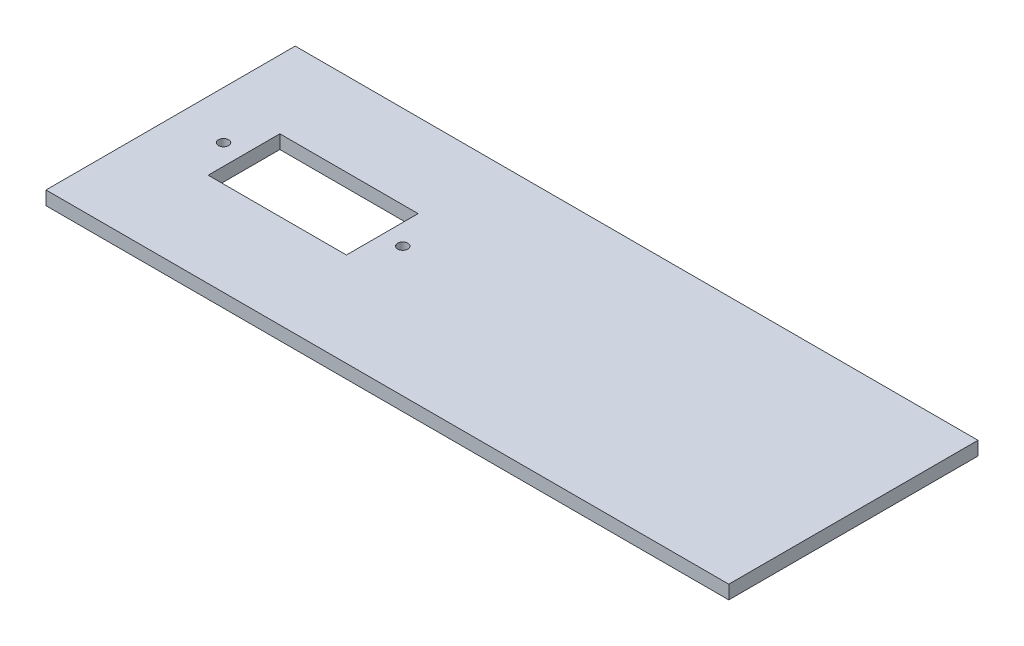
ISO-10303-21;
HEADER;
FILE_DESCRIPTION(('STEP AP214'),'2;1');
FILE_NAME('part.step','',(''),(''),'','','');
FILE_SCHEMA(('AUTOMOTIVE_DESIGN { 1 0 10303 214 1 1 1 1 }'));
ENDSEC;
DATA;
#1=APPLICATION_CONTEXT('core data for automotive mechanical design processes');
#2=APPLICATION_PROTOCOL_DEFINITION('international standard','automotive_design',2000,#1);
#3=PRODUCT_CONTEXT('',#1,'mechanical');
#4=PRODUCT('Part','Part','',(#3));
#5=PRODUCT_RELATED_PRODUCT_CATEGORY('part','',(#4));
#6=PRODUCT_DEFINITION_FORMATION('','',#4);
#7=PRODUCT_DEFINITION_CONTEXT('part definition',#1,'design');
#8=PRODUCT_DEFINITION('design','',#6,#7);
#9=PRODUCT_DEFINITION_SHAPE('','',#8);
#10=(LENGTH_UNIT() NAMED_UNIT(*) SI_UNIT(.MILLI.,.METRE.));
#11=(NAMED_UNIT(*) PLANE_ANGLE_UNIT() SI_UNIT($,.RADIAN.));
#12=(NAMED_UNIT(*) SI_UNIT($,.STERADIAN.) SOLID_ANGLE_UNIT());
#13=UNCERTAINTY_MEASURE_WITH_UNIT(LENGTH_MEASURE(1.E-05),#10,'distance_accuracy_value','');
#14=(GEOMETRIC_REPRESENTATION_CONTEXT(3) GLOBAL_UNCERTAINTY_ASSIGNED_CONTEXT((#13)) GLOBAL_UNIT_ASSIGNED_CONTEXT((#10,
#11,#12)) REPRESENTATION_CONTEXT('',''));
#15=CARTESIAN_POINT('',(0.,0.,0.));
#16=DIRECTION('',(0.,0.,1.));
#17=DIRECTION('',(1.,0.,0.));
#18=AXIS2_PLACEMENT_3D('',#15,#16,#17);
#19=CARTESIAN_POINT('',(-200.,-2.,36.5));
#20=DIRECTION('',(0.,0.,1.));
#21=DIRECTION('',(1.,0.,0.));
#22=AXIS2_PLACEMENT_3D('',#19,#20,#21);
#23=PLANE('',#22);
#24=DIRECTION('',(0.,-1.,0.));
#25=VECTOR('',#24,1.);
#26=CARTESIAN_POINT('',(0.,-2.,36.5));
#27=LINE('',#26,#25);
#28=CARTESIAN_POINT('',(0.,1.99999999999999,36.5));
#29=VERTEX_POINT('',#28);
#30=CARTESIAN_POINT('',(0.,-2.,36.5));
#31=VERTEX_POINT('',#30);
#32=EDGE_CURVE('E123',#29,#31,#27,.T.);
#33=ORIENTED_EDGE('',*,*,#32,.F.);
#34=DIRECTION('',(1.,0.,0.));
#35=VECTOR('',#34,1.);
#36=CARTESIAN_POINT('',(-200.,1.99999999999999,36.5));
#37=LINE('',#36,#35);
#38=CARTESIAN_POINT('',(-200.,1.99999999999999,36.5));
#39=VERTEX_POINT('',#38);
#40=EDGE_CURVE('E150',#39,#29,#37,.T.);
#41=ORIENTED_EDGE('',*,*,#40,.F.);
#42=DIRECTION('',(0.,-1.,0.));
#43=VECTOR('',#42,1.);
#44=CARTESIAN_POINT('',(-200.,-2.,36.5));
#45=LINE('',#44,#43);
#46=CARTESIAN_POINT('',(-200.,-2.,36.5));
#47=VERTEX_POINT('',#46);
#48=EDGE_CURVE('E126',#39,#47,#45,.T.);
#49=ORIENTED_EDGE('',*,*,#48,.T.);
#50=DIRECTION('',(1.,0.,0.));
#51=VECTOR('',#50,1.);
#52=CARTESIAN_POINT('',(-200.,-2.,36.5));
#53=LINE('',#52,#51);
#54=EDGE_CURVE('E139',#47,#31,#53,.T.);
#55=ORIENTED_EDGE('',*,*,#54,.T.);
#56=EDGE_LOOP('',(#33,#41,#49,#55));
#57=FACE_BOUND('',#56,.T.);
#58=ADVANCED_FACE('F32',(#57),#23,.T.);
#59=CARTESIAN_POINT('',(-200.,2.,-36.5));
#60=DIRECTION('',(0.,1.,0.));
#61=DIRECTION('',(0.,0.,1.));
#62=AXIS2_PLACEMENT_3D('',#59,#60,#61);
#63=PLANE('',#62);
#64=CARTESIAN_POINT('',(-133.5,2.,-1.50000000000001));
#65=DIRECTION('',(0.,1.,0.));
#66=DIRECTION('',(0.,0.,-1.));
#67=AXIS2_PLACEMENT_3D('',#64,#65,#66);
#68=CIRCLE('',#67,1.5);
#69=CARTESIAN_POINT('',(-133.5,2.,-3.00000000000001));
#70=VERTEX_POINT('',#69);
#71=EDGE_CURVE('E170',#70,#70,#68,.T.);
#72=ORIENTED_EDGE('',*,*,#71,.F.);
#73=EDGE_LOOP('',(#72));
#74=FACE_BOUND('',#73,.T.);
#75=CARTESIAN_POINT('',(-186.,2.,-1.50000000000001));
#76=DIRECTION('',(0.,1.,0.));
#77=DIRECTION('',(0.,0.,1.));
#78=AXIS2_PLACEMENT_3D('',#75,#76,#77);
#79=CIRCLE('',#78,1.5);
#80=CARTESIAN_POINT('',(-186.,2.,0.));
#81=VERTEX_POINT('',#80);
#82=EDGE_CURVE('E162',#81,#81,#79,.T.);
#83=ORIENTED_EDGE('',*,*,#82,.F.);
#84=EDGE_LOOP('',(#83));
#85=FACE_BOUND('',#84,.T.);
#86=DIRECTION('',(0.,0.,-1.));
#87=VECTOR('',#86,1.);
#88=CARTESIAN_POINT('',(-139.5,2.,-12.));
#89=LINE('',#88,#87);
#90=CARTESIAN_POINT('',(-139.5,2.,8.99999999999999));
#91=VERTEX_POINT('',#90);
#92=CARTESIAN_POINT('',(-139.5,2.,-12.));
#93=VERTEX_POINT('',#92);
#94=EDGE_CURVE('E48',#91,#93,#89,.T.);
#95=ORIENTED_EDGE('',*,*,#94,.F.);
#96=DIRECTION('',(1.,0.,0.));
#97=VECTOR('',#96,1.);
#98=CARTESIAN_POINT('',(-180.,2.,8.99999999999999));
#99=LINE('',#98,#97);
#100=CARTESIAN_POINT('',(-180.,2.,8.99999999999999));
#101=VERTEX_POINT('',#100);
#102=EDGE_CURVE('E116',#101,#91,#99,.T.);
#103=ORIENTED_EDGE('',*,*,#102,.F.);
#104=DIRECTION('',(0.,0.,1.));
#105=VECTOR('',#104,1.);
#106=CARTESIAN_POINT('',(-180.,2.,-12.));
#107=LINE('',#106,#105);
#108=CARTESIAN_POINT('',(-180.,2.,-12.));
#109=VERTEX_POINT('',#108);
#110=EDGE_CURVE('E100',#109,#101,#107,.T.);
#111=ORIENTED_EDGE('',*,*,#110,.F.);
#112=DIRECTION('',(-1.,0.,0.));
#113=VECTOR('',#112,1.);
#114=CARTESIAN_POINT('',(-180.,2.,-12.));
#115=LINE('',#114,#113);
#116=EDGE_CURVE('E109',#93,#109,#115,.T.);
#117=ORIENTED_EDGE('',*,*,#116,.F.);
#118=EDGE_LOOP('',(#95,#103,#111,#117));
#119=FACE_BOUND('',#118,.T.);
#120=DIRECTION('',(0.,0.,1.));
#121=VECTOR('',#120,1.);
#122=CARTESIAN_POINT('',(0.,2.,-36.5));
#123=LINE('',#122,#121);
#124=CARTESIAN_POINT('',(0.,2.,-36.5));
#125=VERTEX_POINT('',#124);
#126=EDGE_CURVE('E130',#125,#29,#123,.T.);
#127=ORIENTED_EDGE('',*,*,#126,.F.);
#128=DIRECTION('',(1.,0.,0.));
#129=VECTOR('',#128,1.);
#130=CARTESIAN_POINT('',(-200.,2.,-36.5));
#131=LINE('',#130,#129);
#132=CARTESIAN_POINT('',(-200.,2.,-36.5));
#133=VERTEX_POINT('',#132);
#134=EDGE_CURVE('E153',#133,#125,#131,.T.);
#135=ORIENTED_EDGE('',*,*,#134,.F.);
#136=DIRECTION('',(0.,0.,1.));
#137=VECTOR('',#136,1.);
#138=CARTESIAN_POINT('',(-200.,2.,-36.5));
#139=LINE('',#138,#137);
#140=EDGE_CURVE('E136',#133,#39,#139,.T.);
#141=ORIENTED_EDGE('',*,*,#140,.T.);
#142=ORIENTED_EDGE('',*,*,#40,.T.);
#143=EDGE_LOOP('',(#127,#135,#141,#142));
#144=FACE_BOUND('',#143,.T.);
#145=ADVANCED_FACE('F113',(#74,#85,#119,#144),#63,.T.);
#146=CARTESIAN_POINT('',(-200.,-2.,-36.5));
#147=DIRECTION('',(0.,0.,-1.));
#148=DIRECTION('',(-1.,0.,0.));
#149=AXIS2_PLACEMENT_3D('',#146,#147,#148);
#150=PLANE('',#149);
#151=DIRECTION('',(0.,1.,0.));
#152=VECTOR('',#151,1.);
#153=CARTESIAN_POINT('',(0.,-2.,-36.5));
#154=LINE('',#153,#152);
#155=CARTESIAN_POINT('',(0.,-2.,-36.5));
#156=VERTEX_POINT('',#155);
#157=EDGE_CURVE('E145',#156,#125,#154,.T.);
#158=ORIENTED_EDGE('',*,*,#157,.F.);
#159=DIRECTION('',(1.,0.,0.));
#160=VECTOR('',#159,1.);
#161=CARTESIAN_POINT('',(-200.,-2.,-36.5));
#162=LINE('',#161,#160);
#163=CARTESIAN_POINT('',(-200.,-2.,-36.5));
#164=VERTEX_POINT('',#163);
#165=EDGE_CURVE('E155',#164,#156,#162,.T.);
#166=ORIENTED_EDGE('',*,*,#165,.F.);
#167=DIRECTION('',(0.,1.,0.));
#168=VECTOR('',#167,1.);
#169=CARTESIAN_POINT('',(-200.,-2.,-36.5));
#170=LINE('',#169,#168);
#171=EDGE_CURVE('E133',#164,#133,#170,.T.);
#172=ORIENTED_EDGE('',*,*,#171,.T.);
#173=ORIENTED_EDGE('',*,*,#134,.T.);
#174=EDGE_LOOP('',(#158,#166,#172,#173));
#175=FACE_BOUND('',#174,.T.);
#176=ADVANCED_FACE('F179',(#175),#150,.T.);
#177=CARTESIAN_POINT('',(-200.,-2.,-36.5));
#178=DIRECTION('',(0.,-1.,0.));
#179=DIRECTION('',(0.,0.,-1.));
#180=AXIS2_PLACEMENT_3D('',#177,#178,#179);
#181=PLANE('',#180);
#182=CARTESIAN_POINT('',(-133.5,-2.,-1.50000000000002));
#183=DIRECTION('',(0.,-1.,0.));
#184=DIRECTION('',(0.,0.,-1.));
#185=AXIS2_PLACEMENT_3D('',#182,#183,#184);
#186=CIRCLE('',#185,1.5);
#187=CARTESIAN_POINT('',(-133.5,-2.,-3.00000000000001));
#188=VERTEX_POINT('',#187);
#189=EDGE_CURVE('E35',#188,#188,#186,.T.);
#190=ORIENTED_EDGE('',*,*,#189,.F.);
#191=EDGE_LOOP('',(#190));
#192=FACE_BOUND('',#191,.T.);
#193=CARTESIAN_POINT('',(-186.,-2.,-1.50000000000001));
#194=DIRECTION('',(0.,-1.,0.));
#195=DIRECTION('',(0.,0.,-1.));
#196=AXIS2_PLACEMENT_3D('',#193,#194,#195);
#197=CIRCLE('',#196,1.5);
#198=CARTESIAN_POINT('',(-186.,-2.,-3.00000000000001));
#199=VERTEX_POINT('',#198);
#200=EDGE_CURVE('E160',#199,#199,#197,.T.);
#201=ORIENTED_EDGE('',*,*,#200,.F.);
#202=EDGE_LOOP('',(#201));
#203=FACE_BOUND('',#202,.T.);
#204=DIRECTION('',(0.,0.,1.));
#205=VECTOR('',#204,1.);
#206=CARTESIAN_POINT('',(-139.5,-2.,-36.5));
#207=LINE('',#206,#205);
#208=CARTESIAN_POINT('',(-139.5,-2.,-12.));
#209=VERTEX_POINT('',#208);
#210=CARTESIAN_POINT('',(-139.5,-2.,8.99999999999999));
#211=VERTEX_POINT('',#210);
#212=EDGE_CURVE('E11',#209,#211,#207,.T.);
#213=ORIENTED_EDGE('',*,*,#212,.F.);
#214=DIRECTION('',(1.,0.,0.));
#215=VECTOR('',#214,1.);
#216=CARTESIAN_POINT('',(-200.,-2.,-12.));
#217=LINE('',#216,#215);
#218=CARTESIAN_POINT('',(-180.,-2.,-12.));
#219=VERTEX_POINT('',#218);
#220=EDGE_CURVE('E152',#219,#209,#217,.T.);
#221=ORIENTED_EDGE('',*,*,#220,.F.);
#222=DIRECTION('',(0.,0.,-1.));
#223=VECTOR('',#222,1.);
#224=CARTESIAN_POINT('',(-180.,-2.,-36.5));
#225=LINE('',#224,#223);
#226=CARTESIAN_POINT('',(-180.,-2.,8.99999999999999));
#227=VERTEX_POINT('',#226);
#228=EDGE_CURVE('E103',#227,#219,#225,.T.);
#229=ORIENTED_EDGE('',*,*,#228,.F.);
#230=DIRECTION('',(-1.,0.,0.));
#231=VECTOR('',#230,1.);
#232=CARTESIAN_POINT('',(-200.,-2.,8.99999999999999));
#233=LINE('',#232,#231);
#234=EDGE_CURVE('E40',#211,#227,#233,.T.);
#235=ORIENTED_EDGE('',*,*,#234,.F.);
#236=EDGE_LOOP('',(#213,#221,#229,#235));
#237=FACE_BOUND('',#236,.T.);
#238=DIRECTION('',(0.,0.,-1.));
#239=VECTOR('',#238,1.);
#240=CARTESIAN_POINT('',(0.,-2.,-36.5));
#241=LINE('',#240,#239);
#242=EDGE_CURVE('E142',#31,#156,#241,.T.);
#243=ORIENTED_EDGE('',*,*,#242,.F.);
#244=ORIENTED_EDGE('',*,*,#54,.F.);
#245=DIRECTION('',(0.,0.,-1.));
#246=VECTOR('',#245,1.);
#247=CARTESIAN_POINT('',(-200.,-2.,-36.5));
#248=LINE('',#247,#246);
#249=EDGE_CURVE('E129',#47,#164,#248,.T.);
#250=ORIENTED_EDGE('',*,*,#249,.T.);
#251=ORIENTED_EDGE('',*,*,#165,.T.);
#252=EDGE_LOOP('',(#243,#244,#250,#251));
#253=FACE_BOUND('',#252,.T.);
#254=ADVANCED_FACE('F186',(#192,#203,#237,#253),#181,.T.);
#255=CARTESIAN_POINT('',(-200.,0.,0.));
#256=DIRECTION('',(1.,0.,0.));
#257=DIRECTION('',(0.,0.,-1.));
#258=AXIS2_PLACEMENT_3D('',#255,#256,#257);
#259=PLANE('',#258);
#260=ORIENTED_EDGE('',*,*,#48,.F.);
#261=ORIENTED_EDGE('',*,*,#140,.F.);
#262=ORIENTED_EDGE('',*,*,#171,.F.);
#263=ORIENTED_EDGE('',*,*,#249,.F.);
#264=EDGE_LOOP('',(#260,#261,#262,#263));
#265=FACE_BOUND('',#264,.T.);
#266=ADVANCED_FACE('F194',(#265),#259,.F.);
#267=CARTESIAN_POINT('',(0.,0.,0.));
#268=DIRECTION('',(1.,0.,0.));
#269=DIRECTION('',(0.,0.,-1.));
#270=AXIS2_PLACEMENT_3D('',#267,#268,#269);
#271=PLANE('',#270);
#272=ORIENTED_EDGE('',*,*,#32,.T.);
#273=ORIENTED_EDGE('',*,*,#242,.T.);
#274=ORIENTED_EDGE('',*,*,#157,.T.);
#275=ORIENTED_EDGE('',*,*,#126,.T.);
#276=EDGE_LOOP('',(#272,#273,#274,#275));
#277=FACE_BOUND('',#276,.T.);
#278=ADVANCED_FACE('F192',(#277),#271,.T.);
#279=CARTESIAN_POINT('',(-139.5,-1998.,-12.0000000000003));
#280=DIRECTION('',(1.,0.,0.));
#281=DIRECTION('',(0.,0.,-1.));
#282=AXIS2_PLACEMENT_3D('',#279,#280,#281);
#283=PLANE('',#282);
#284=ORIENTED_EDGE('',*,*,#212,.T.);
#285=DIRECTION('',(0.,1.,0.));
#286=VECTOR('',#285,1.);
#287=CARTESIAN_POINT('',(-139.5,-1998.,8.99999999999974));
#288=LINE('',#287,#286);
#289=EDGE_CURVE('E121',#211,#91,#288,.T.);
#290=ORIENTED_EDGE('',*,*,#289,.T.);
#291=ORIENTED_EDGE('',*,*,#94,.T.);
#292=DIRECTION('',(0.,1.,0.));
#293=VECTOR('',#292,1.);
#294=CARTESIAN_POINT('',(-139.5,-1998.,-12.0000000000003));
#295=LINE('',#294,#293);
#296=EDGE_CURVE('E106',#209,#93,#295,.T.);
#297=ORIENTED_EDGE('',*,*,#296,.F.);
#298=EDGE_LOOP('',(#284,#290,#291,#297));
#299=FACE_BOUND('',#298,.T.);
#300=ADVANCED_FACE('F217',(#299),#283,.F.);
#301=CARTESIAN_POINT('',(-180.,-1998.,8.99999999999974));
#302=DIRECTION('',(0.,0.,1.));
#303=DIRECTION('',(0.,-1.,0.));
#304=AXIS2_PLACEMENT_3D('',#301,#302,#303);
#305=PLANE('',#304);
#306=ORIENTED_EDGE('',*,*,#234,.T.);
#307=DIRECTION('',(0.,1.,0.));
#308=VECTOR('',#307,1.);
#309=CARTESIAN_POINT('',(-180.,-1998.,8.99999999999974));
#310=LINE('',#309,#308);
#311=EDGE_CURVE('E105',#227,#101,#310,.T.);
#312=ORIENTED_EDGE('',*,*,#311,.T.);
#313=ORIENTED_EDGE('',*,*,#102,.T.);
#314=ORIENTED_EDGE('',*,*,#289,.F.);
#315=EDGE_LOOP('',(#306,#312,#313,#314));
#316=FACE_BOUND('',#315,.T.);
#317=ADVANCED_FACE('F220',(#316),#305,.F.);
#318=CARTESIAN_POINT('',(-180.,-1998.,-12.0000000000003));
#319=DIRECTION('',(-1.,0.,0.));
#320=DIRECTION('',(0.,0.,1.));
#321=AXIS2_PLACEMENT_3D('',#318,#319,#320);
#322=PLANE('',#321);
#323=ORIENTED_EDGE('',*,*,#228,.T.);
#324=DIRECTION('',(0.,1.,0.));
#325=VECTOR('',#324,1.);
#326=CARTESIAN_POINT('',(-180.,-1998.,-12.0000000000003));
#327=LINE('',#326,#325);
#328=EDGE_CURVE('E56',#219,#109,#327,.T.);
#329=ORIENTED_EDGE('',*,*,#328,.T.);
#330=ORIENTED_EDGE('',*,*,#110,.T.);
#331=ORIENTED_EDGE('',*,*,#311,.F.);
#332=EDGE_LOOP('',(#323,#329,#330,#331));
#333=FACE_BOUND('',#332,.T.);
#334=ADVANCED_FACE('F97',(#333),#322,.F.);
#335=CARTESIAN_POINT('',(-180.,-1998.,-12.0000000000003));
#336=DIRECTION('',(0.,0.,-1.));
#337=DIRECTION('',(0.,1.,0.));
#338=AXIS2_PLACEMENT_3D('',#335,#336,#337);
#339=PLANE('',#338);
#340=ORIENTED_EDGE('',*,*,#220,.T.);
#341=ORIENTED_EDGE('',*,*,#296,.T.);
#342=ORIENTED_EDGE('',*,*,#116,.T.);
#343=ORIENTED_EDGE('',*,*,#328,.F.);
#344=EDGE_LOOP('',(#340,#341,#342,#343));
#345=FACE_BOUND('',#344,.T.);
#346=ADVANCED_FACE('F110',(#345),#339,.F.);
#347=CARTESIAN_POINT('',(-186.,-1998.,-1.50000000000026));
#348=DIRECTION('',(0.,1.,0.));
#349=DIRECTION('',(0.,0.,1.));
#350=AXIS2_PLACEMENT_3D('',#347,#348,#349);
#351=CYLINDRICAL_SURFACE('',#350,1.5);
#352=ORIENTED_EDGE('',*,*,#200,.T.);
#353=EDGE_LOOP('',(#352));
#354=FACE_BOUND('',#353,.T.);
#355=ORIENTED_EDGE('',*,*,#82,.T.);
#356=EDGE_LOOP('',(#355));
#357=FACE_BOUND('',#356,.T.);
#358=ADVANCED_FACE('F229',(#354,#357),#351,.F.);
#359=CARTESIAN_POINT('',(-133.5,-1998.,-1.50000000000026));
#360=DIRECTION('',(0.,1.,0.));
#361=DIRECTION('',(0.,0.,1.));
#362=AXIS2_PLACEMENT_3D('',#359,#360,#361);
#363=CYLINDRICAL_SURFACE('',#362,1.5);
#364=ORIENTED_EDGE('',*,*,#189,.T.);
#365=EDGE_LOOP('',(#364));
#366=FACE_BOUND('',#365,.T.);
#367=ORIENTED_EDGE('',*,*,#71,.T.);
#368=EDGE_LOOP('',(#367));
#369=FACE_BOUND('',#368,.T.);
#370=ADVANCED_FACE('F175',(#366,#369),#363,.F.);
#371=CLOSED_SHELL('',(#58,#145,#176,#254,#266,#278,#300,#317,#334,#346,#358,#370));
#372=MANIFOLD_SOLID_BREP('B2',#371);
#373=ADVANCED_BREP_SHAPE_REPRESENTATION('',(#18,#372),#14);
#374=SHAPE_DEFINITION_REPRESENTATION(#9,#373);
ENDSEC;
END-ISO-10303-21;
